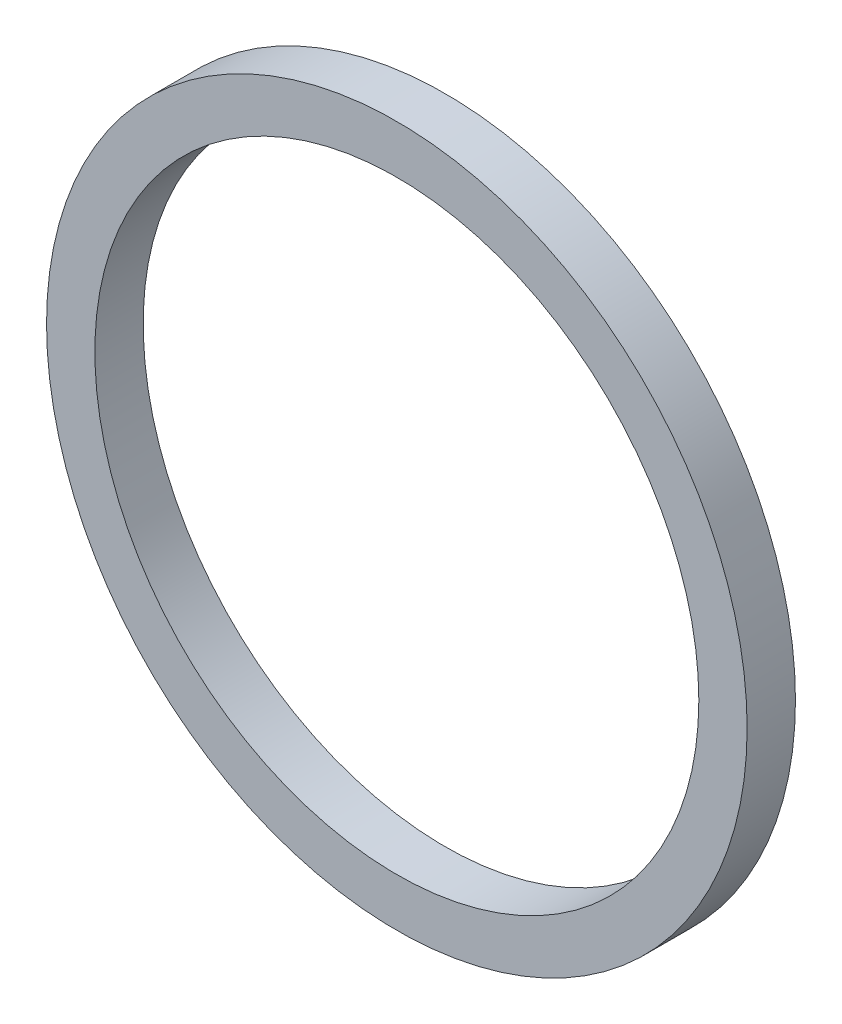
ISO-10303-21;
HEADER;
FILE_DESCRIPTION(('STEP AP214'),'2;1');
FILE_NAME('part.step','',(''),(''),'','','');
FILE_SCHEMA(('AUTOMOTIVE_DESIGN { 1 0 10303 214 1 1 1 1 }'));
ENDSEC;
DATA;
#1=APPLICATION_CONTEXT('core data for automotive mechanical design processes');
#2=APPLICATION_PROTOCOL_DEFINITION('international standard','automotive_design',2000,#1);
#3=PRODUCT_CONTEXT('',#1,'mechanical');
#4=PRODUCT('Part','Part','',(#3));
#5=PRODUCT_RELATED_PRODUCT_CATEGORY('part','',(#4));
#6=PRODUCT_DEFINITION_FORMATION('','',#4);
#7=PRODUCT_DEFINITION_CONTEXT('part definition',#1,'design');
#8=PRODUCT_DEFINITION('design','',#6,#7);
#9=PRODUCT_DEFINITION_SHAPE('','',#8);
#10=(LENGTH_UNIT() NAMED_UNIT(*) SI_UNIT(.MILLI.,.METRE.));
#11=(NAMED_UNIT(*) PLANE_ANGLE_UNIT() SI_UNIT($,.RADIAN.));
#12=(NAMED_UNIT(*) SI_UNIT($,.STERADIAN.) SOLID_ANGLE_UNIT());
#13=UNCERTAINTY_MEASURE_WITH_UNIT(LENGTH_MEASURE(1.E-05),#10,'distance_accuracy_value','');
#14=(GEOMETRIC_REPRESENTATION_CONTEXT(3) GLOBAL_UNCERTAINTY_ASSIGNED_CONTEXT((#13)) GLOBAL_UNIT_ASSIGNED_CONTEXT((#10,
#11,#12)) REPRESENTATION_CONTEXT('',''));
#15=CARTESIAN_POINT('',(0.,0.,0.));
#16=DIRECTION('',(0.,0.,1.));
#17=DIRECTION('',(1.,0.,0.));
#18=AXIS2_PLACEMENT_3D('',#15,#16,#17);
#19=CARTESIAN_POINT('',(0.,0.,2.));
#20=DIRECTION('',(0.,0.,1.00000000000001));
#21=DIRECTION('',(1.00000000000001,0.,0.));
#22=AXIS2_PLACEMENT_3D('',#19,#20,#21);
#23=PLANE('',#22);
#24=CARTESIAN_POINT('',(0.,0.,2.));
#25=DIRECTION('',(0.,0.,1.00000000000001));
#26=DIRECTION('',(1.00000000000001,0.,0.));
#27=AXIS2_PLACEMENT_3D('',#24,#25,#26);
#28=CIRCLE('',#27,14.5);
#29=CARTESIAN_POINT('',(14.5000000000001,0.,2.));
#30=VERTEX_POINT('',#29);
#31=EDGE_CURVE('E10',#30,#30,#28,.T.);
#32=ORIENTED_EDGE('',*,*,#31,.T.);
#33=EDGE_LOOP('',(#32));
#34=FACE_BOUND('',#33,.T.);
#35=CARTESIAN_POINT('',(0.,0.,2.));
#36=DIRECTION('',(0.,0.,1.00000000000001));
#37=DIRECTION('',(1.00000000000001,0.,0.));
#38=AXIS2_PLACEMENT_3D('',#35,#36,#37);
#39=CIRCLE('',#38,12.5);
#40=CARTESIAN_POINT('',(12.5000000000001,0.,2.));
#41=VERTEX_POINT('',#40);
#42=EDGE_CURVE('E46',#41,#41,#39,.T.);
#43=ORIENTED_EDGE('',*,*,#42,.F.);
#44=EDGE_LOOP('',(#43));
#45=FACE_BOUND('',#44,.T.);
#46=ADVANCED_FACE('F35',(#34,#45),#23,.T.);
#47=CARTESIAN_POINT('',(0.,0.,0.));
#48=DIRECTION('',(0.,0.,1.00000000000001));
#49=DIRECTION('',(1.00000000000001,0.,0.));
#50=AXIS2_PLACEMENT_3D('',#47,#48,#49);
#51=PLANE('',#50);
#52=CARTESIAN_POINT('',(0.,0.,0.));
#53=DIRECTION('',(0.,0.,1.00000000000001));
#54=DIRECTION('',(1.00000000000001,0.,0.));
#55=AXIS2_PLACEMENT_3D('',#52,#53,#54);
#56=CIRCLE('',#55,14.5);
#57=CARTESIAN_POINT('',(14.5000000000001,0.,0.));
#58=VERTEX_POINT('',#57);
#59=EDGE_CURVE('E39',#58,#58,#56,.T.);
#60=ORIENTED_EDGE('',*,*,#59,.F.);
#61=EDGE_LOOP('',(#60));
#62=FACE_BOUND('',#61,.T.);
#63=CARTESIAN_POINT('',(0.,0.,0.));
#64=DIRECTION('',(0.,0.,1.00000000000001));
#65=DIRECTION('',(1.00000000000001,0.,0.));
#66=AXIS2_PLACEMENT_3D('',#63,#64,#65);
#67=CIRCLE('',#66,12.5);
#68=CARTESIAN_POINT('',(12.5000000000001,0.,0.));
#69=VERTEX_POINT('',#68);
#70=EDGE_CURVE('E48',#69,#69,#67,.T.);
#71=ORIENTED_EDGE('',*,*,#70,.T.);
#72=EDGE_LOOP('',(#71));
#73=FACE_BOUND('',#72,.T.);
#74=ADVANCED_FACE('F58',(#62,#73),#51,.F.);
#75=CARTESIAN_POINT('',(0.,0.,2.));
#76=DIRECTION('',(0.,0.,-1.00000000000001));
#77=DIRECTION('',(-1.00000000000001,0.,0.));
#78=AXIS2_PLACEMENT_3D('',#75,#76,#77);
#79=CYLINDRICAL_SURFACE('',#78,14.5);
#80=ORIENTED_EDGE('',*,*,#31,.F.);
#81=EDGE_LOOP('',(#80));
#82=FACE_BOUND('',#81,.T.);
#83=ORIENTED_EDGE('',*,*,#59,.T.);
#84=EDGE_LOOP('',(#83));
#85=FACE_BOUND('',#84,.T.);
#86=ADVANCED_FACE('F37',(#82,#85),#79,.T.);
#87=CARTESIAN_POINT('',(0.,0.,2.));
#88=DIRECTION('',(0.,0.,-1.00000000000001));
#89=DIRECTION('',(-1.00000000000001,0.,0.));
#90=AXIS2_PLACEMENT_3D('',#87,#88,#89);
#91=CYLINDRICAL_SURFACE('',#90,12.5);
#92=ORIENTED_EDGE('',*,*,#42,.T.);
#93=EDGE_LOOP('',(#92));
#94=FACE_BOUND('',#93,.T.);
#95=ORIENTED_EDGE('',*,*,#70,.F.);
#96=EDGE_LOOP('',(#95));
#97=FACE_BOUND('',#96,.T.);
#98=ADVANCED_FACE('F54',(#94,#97),#91,.F.);
#99=CLOSED_SHELL('',(#46,#74,#86,#98));
#100=MANIFOLD_SOLID_BREP('B2',#99);
#101=ADVANCED_BREP_SHAPE_REPRESENTATION('',(#18,#100),#14);
#102=SHAPE_DEFINITION_REPRESENTATION(#9,#101);
ENDSEC;
END-ISO-10303-21;
